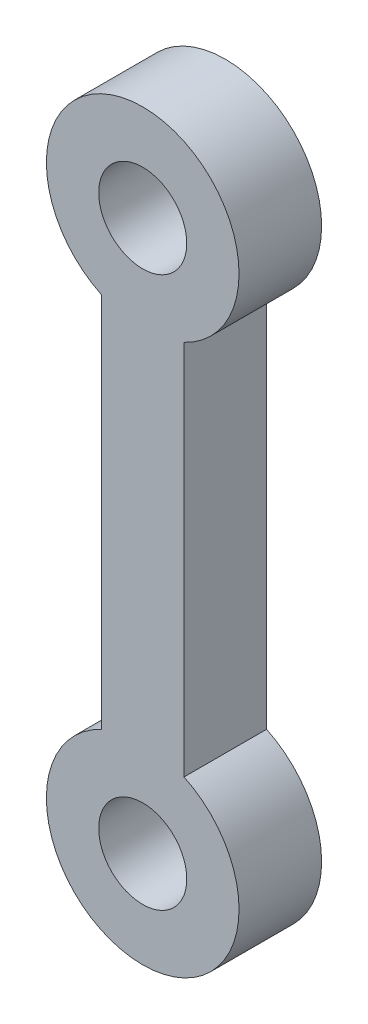
ISO-10303-21;
HEADER;
FILE_DESCRIPTION(('STEP AP214'),'2;1');
FILE_NAME('part.step','',(''),(''),'','','');
FILE_SCHEMA(('AUTOMOTIVE_DESIGN { 1 0 10303 214 1 1 1 1 }'));
ENDSEC;
DATA;
#1=APPLICATION_CONTEXT('core data for automotive mechanical design processes');
#2=APPLICATION_PROTOCOL_DEFINITION('international standard','automotive_design',2000,#1);
#3=PRODUCT_CONTEXT('',#1,'mechanical');
#4=PRODUCT('Part','Part','',(#3));
#5=PRODUCT_RELATED_PRODUCT_CATEGORY('part','',(#4));
#6=PRODUCT_DEFINITION_FORMATION('','',#4);
#7=PRODUCT_DEFINITION_CONTEXT('part definition',#1,'design');
#8=PRODUCT_DEFINITION('design','',#6,#7);
#9=PRODUCT_DEFINITION_SHAPE('','',#8);
#10=(LENGTH_UNIT() NAMED_UNIT(*) SI_UNIT(.MILLI.,.METRE.));
#11=(NAMED_UNIT(*) PLANE_ANGLE_UNIT() SI_UNIT($,.RADIAN.));
#12=(NAMED_UNIT(*) SI_UNIT($,.STERADIAN.) SOLID_ANGLE_UNIT());
#13=UNCERTAINTY_MEASURE_WITH_UNIT(LENGTH_MEASURE(1.E-05),#10,'distance_accuracy_value','');
#14=(GEOMETRIC_REPRESENTATION_CONTEXT(3) GLOBAL_UNCERTAINTY_ASSIGNED_CONTEXT((#13)) GLOBAL_UNIT_ASSIGNED_CONTEXT((#10,
#11,#12)) REPRESENTATION_CONTEXT('',''));
#15=CARTESIAN_POINT('',(0.,0.,0.));
#16=DIRECTION('',(0.,0.,1.));
#17=DIRECTION('',(1.,0.,0.));
#18=AXIS2_PLACEMENT_3D('',#15,#16,#17);
#19=CARTESIAN_POINT('',(0.,0.,3.));
#20=DIRECTION('',(0.,0.,-1.));
#21=DIRECTION('',(-1.,0.,0.));
#22=AXIS2_PLACEMENT_3D('',#19,#20,#21);
#23=CYLINDRICAL_SURFACE('',#22,3.5);
#24=CARTESIAN_POINT('',(0.,0.,0.));
#25=DIRECTION('',(0.,0.,1.));
#26=DIRECTION('',(1.,0.,0.));
#27=AXIS2_PLACEMENT_3D('',#24,#25,#26);
#28=CIRCLE('',#27,3.5);
#29=CARTESIAN_POINT('',(1.5,-3.16227766016838,0.));
#30=VERTEX_POINT('',#29);
#31=CARTESIAN_POINT('',(-1.5,-3.16227766016838,0.));
#32=VERTEX_POINT('',#31);
#33=EDGE_CURVE('E121',#30,#32,#28,.T.);
#34=ORIENTED_EDGE('',*,*,#33,.T.);
#35=DIRECTION('',(0.,0.,-1.));
#36=VECTOR('',#35,1.);
#37=CARTESIAN_POINT('',(-1.5,-3.16227766016838,3.));
#38=LINE('',#37,#36);
#39=CARTESIAN_POINT('',(-1.5,-3.16227766016838,3.));
#40=VERTEX_POINT('',#39);
#41=EDGE_CURVE('E12',#40,#32,#38,.T.);
#42=ORIENTED_EDGE('',*,*,#41,.F.);
#43=CARTESIAN_POINT('',(0.,0.,3.));
#44=DIRECTION('',(0.,0.,1.));
#45=DIRECTION('',(1.,0.,0.));
#46=AXIS2_PLACEMENT_3D('',#43,#44,#45);
#47=CIRCLE('',#46,3.5);
#48=CARTESIAN_POINT('',(1.5,-3.16227766016838,3.));
#49=VERTEX_POINT('',#48);
#50=EDGE_CURVE('E103',#49,#40,#47,.T.);
#51=ORIENTED_EDGE('',*,*,#50,.F.);
#52=DIRECTION('',(0.,0.,-1.));
#53=VECTOR('',#52,1.);
#54=CARTESIAN_POINT('',(1.5,-3.16227766016838,3.));
#55=LINE('',#54,#53);
#56=EDGE_CURVE('E70',#49,#30,#55,.T.);
#57=ORIENTED_EDGE('',*,*,#56,.T.);
#58=EDGE_LOOP('',(#34,#42,#51,#57));
#59=FACE_BOUND('',#58,.T.);
#60=ADVANCED_FACE('F53',(#59),#23,.T.);
#61=CARTESIAN_POINT('',(-1.5,0.,3.));
#62=DIRECTION('',(1.,0.,0.));
#63=DIRECTION('',(0.,1.,0.));
#64=AXIS2_PLACEMENT_3D('',#61,#62,#63);
#65=PLANE('',#64);
#66=DIRECTION('',(0.,-1.,0.));
#67=VECTOR('',#66,1.);
#68=CARTESIAN_POINT('',(-1.5,0.,0.));
#69=LINE('',#68,#67);
#70=CARTESIAN_POINT('',(-1.5,-16.8377223398316,0.));
#71=VERTEX_POINT('',#70);
#72=EDGE_CURVE('E109',#32,#71,#69,.T.);
#73=ORIENTED_EDGE('',*,*,#72,.T.);
#74=DIRECTION('',(0.,0.,-1.));
#75=VECTOR('',#74,1.);
#76=CARTESIAN_POINT('',(-1.5,-16.8377223398316,3.));
#77=LINE('',#76,#75);
#78=CARTESIAN_POINT('',(-1.5,-16.8377223398316,3.));
#79=VERTEX_POINT('',#78);
#80=EDGE_CURVE('E62',#79,#71,#77,.T.);
#81=ORIENTED_EDGE('',*,*,#80,.F.);
#82=DIRECTION('',(0.,-1.,0.));
#83=VECTOR('',#82,1.);
#84=CARTESIAN_POINT('',(-1.5,0.,3.));
#85=LINE('',#84,#83);
#86=EDGE_CURVE('E96',#40,#79,#85,.T.);
#87=ORIENTED_EDGE('',*,*,#86,.F.);
#88=ORIENTED_EDGE('',*,*,#41,.T.);
#89=EDGE_LOOP('',(#73,#81,#87,#88));
#90=FACE_BOUND('',#89,.T.);
#91=ADVANCED_FACE('F108',(#90),#65,.F.);
#92=CARTESIAN_POINT('',(0.,-20.,3.));
#93=DIRECTION('',(0.,0.,-1.));
#94=DIRECTION('',(-1.,0.,0.));
#95=AXIS2_PLACEMENT_3D('',#92,#93,#94);
#96=CYLINDRICAL_SURFACE('',#95,3.5);
#97=CARTESIAN_POINT('',(0.,-20.,0.));
#98=DIRECTION('',(0.,0.,1.));
#99=DIRECTION('',(1.,0.,0.));
#100=AXIS2_PLACEMENT_3D('',#97,#98,#99);
#101=CIRCLE('',#100,3.5);
#102=CARTESIAN_POINT('',(1.5,-16.8377223398316,0.));
#103=VERTEX_POINT('',#102);
#104=EDGE_CURVE('E127',#71,#103,#101,.T.);
#105=ORIENTED_EDGE('',*,*,#104,.T.);
#106=DIRECTION('',(0.,0.,-1.));
#107=VECTOR('',#106,1.);
#108=CARTESIAN_POINT('',(1.5,-16.8377223398316,3.));
#109=LINE('',#108,#107);
#110=CARTESIAN_POINT('',(1.5,-16.8377223398316,3.));
#111=VERTEX_POINT('',#110);
#112=EDGE_CURVE('E85',#111,#103,#109,.T.);
#113=ORIENTED_EDGE('',*,*,#112,.F.);
#114=CARTESIAN_POINT('',(0.,-20.,3.));
#115=DIRECTION('',(0.,0.,1.));
#116=DIRECTION('',(1.,0.,0.));
#117=AXIS2_PLACEMENT_3D('',#114,#115,#116);
#118=CIRCLE('',#117,3.5);
#119=EDGE_CURVE('E102',#79,#111,#118,.T.);
#120=ORIENTED_EDGE('',*,*,#119,.F.);
#121=ORIENTED_EDGE('',*,*,#80,.T.);
#122=EDGE_LOOP('',(#105,#113,#120,#121));
#123=FACE_BOUND('',#122,.T.);
#124=ADVANCED_FACE('F113',(#123),#96,.T.);
#125=CARTESIAN_POINT('',(1.5,0.,3.));
#126=DIRECTION('',(1.,0.,0.));
#127=DIRECTION('',(0.,1.,0.));
#128=AXIS2_PLACEMENT_3D('',#125,#126,#127);
#129=PLANE('',#128);
#130=DIRECTION('',(0.,-1.,0.));
#131=VECTOR('',#130,1.);
#132=CARTESIAN_POINT('',(1.5,0.,0.));
#133=LINE('',#132,#131);
#134=EDGE_CURVE('E130',#30,#103,#133,.T.);
#135=ORIENTED_EDGE('',*,*,#134,.F.);
#136=ORIENTED_EDGE('',*,*,#56,.F.);
#137=DIRECTION('',(0.,-1.,0.));
#138=VECTOR('',#137,1.);
#139=CARTESIAN_POINT('',(1.5,0.,3.));
#140=LINE('',#139,#138);
#141=EDGE_CURVE('E115',#49,#111,#140,.T.);
#142=ORIENTED_EDGE('',*,*,#141,.T.);
#143=ORIENTED_EDGE('',*,*,#112,.T.);
#144=EDGE_LOOP('',(#135,#136,#142,#143));
#145=FACE_BOUND('',#144,.T.);
#146=ADVANCED_FACE('F168',(#145),#129,.T.);
#147=CARTESIAN_POINT('',(0.,0.,3.));
#148=DIRECTION('',(0.,0.,1.));
#149=DIRECTION('',(1.,0.,0.));
#150=AXIS2_PLACEMENT_3D('',#147,#148,#149);
#151=PLANE('',#150);
#152=CARTESIAN_POINT('',(0.,-20.,3.));
#153=DIRECTION('',(0.,0.,1.));
#154=DIRECTION('',(1.,0.,0.));
#155=AXIS2_PLACEMENT_3D('',#152,#153,#154);
#156=CIRCLE('',#155,1.6);
#157=CARTESIAN_POINT('',(1.6,-20.,3.));
#158=VERTEX_POINT('',#157);
#159=EDGE_CURVE('E148',#158,#158,#156,.T.);
#160=ORIENTED_EDGE('',*,*,#159,.F.);
#161=EDGE_LOOP('',(#160));
#162=FACE_BOUND('',#161,.T.);
#163=CARTESIAN_POINT('',(0.,0.,3.));
#164=DIRECTION('',(0.,0.,1.));
#165=DIRECTION('',(1.,0.,0.));
#166=AXIS2_PLACEMENT_3D('',#163,#164,#165);
#167=CIRCLE('',#166,1.6);
#168=CARTESIAN_POINT('',(1.6,0.,3.));
#169=VERTEX_POINT('',#168);
#170=EDGE_CURVE('E144',#169,#169,#167,.T.);
#171=ORIENTED_EDGE('',*,*,#170,.F.);
#172=EDGE_LOOP('',(#171));
#173=FACE_BOUND('',#172,.T.);
#174=ORIENTED_EDGE('',*,*,#50,.T.);
#175=ORIENTED_EDGE('',*,*,#86,.T.);
#176=ORIENTED_EDGE('',*,*,#119,.T.);
#177=ORIENTED_EDGE('',*,*,#141,.F.);
#178=EDGE_LOOP('',(#174,#175,#176,#177));
#179=FACE_BOUND('',#178,.T.);
#180=ADVANCED_FACE('F99',(#162,#173,#179),#151,.T.);
#181=CARTESIAN_POINT('',(0.,0.,0.));
#182=DIRECTION('',(0.,0.,1.));
#183=DIRECTION('',(1.,0.,0.));
#184=AXIS2_PLACEMENT_3D('',#181,#182,#183);
#185=PLANE('',#184);
#186=CARTESIAN_POINT('',(0.,-20.,0.));
#187=DIRECTION('',(0.,0.,1.));
#188=DIRECTION('',(1.,0.,0.));
#189=AXIS2_PLACEMENT_3D('',#186,#187,#188);
#190=CIRCLE('',#189,1.6);
#191=CARTESIAN_POINT('',(1.6,-20.,0.));
#192=VERTEX_POINT('',#191);
#193=EDGE_CURVE('E124',#192,#192,#190,.T.);
#194=ORIENTED_EDGE('',*,*,#193,.T.);
#195=EDGE_LOOP('',(#194));
#196=FACE_BOUND('',#195,.T.);
#197=CARTESIAN_POINT('',(0.,0.,0.));
#198=DIRECTION('',(0.,0.,1.));
#199=DIRECTION('',(1.,0.,0.));
#200=AXIS2_PLACEMENT_3D('',#197,#198,#199);
#201=CIRCLE('',#200,1.6);
#202=CARTESIAN_POINT('',(1.6,0.,0.));
#203=VERTEX_POINT('',#202);
#204=EDGE_CURVE('E140',#203,#203,#201,.T.);
#205=ORIENTED_EDGE('',*,*,#204,.T.);
#206=EDGE_LOOP('',(#205));
#207=FACE_BOUND('',#206,.T.);
#208=ORIENTED_EDGE('',*,*,#33,.F.);
#209=ORIENTED_EDGE('',*,*,#134,.T.);
#210=ORIENTED_EDGE('',*,*,#104,.F.);
#211=ORIENTED_EDGE('',*,*,#72,.F.);
#212=EDGE_LOOP('',(#208,#209,#210,#211));
#213=FACE_BOUND('',#212,.T.);
#214=ADVANCED_FACE('F156',(#196,#207,#213),#185,.F.);
#215=CARTESIAN_POINT('',(0.,0.,0.));
#216=DIRECTION('',(0.,0.,1.));
#217=DIRECTION('',(1.,0.,0.));
#218=AXIS2_PLACEMENT_3D('',#215,#216,#217);
#219=CYLINDRICAL_SURFACE('',#218,1.6);
#220=ORIENTED_EDGE('',*,*,#204,.F.);
#221=EDGE_LOOP('',(#220));
#222=FACE_BOUND('',#221,.T.);
#223=ORIENTED_EDGE('',*,*,#170,.T.);
#224=EDGE_LOOP('',(#223));
#225=FACE_BOUND('',#224,.T.);
#226=ADVANCED_FACE('F162',(#222,#225),#219,.F.);
#227=CARTESIAN_POINT('',(0.,-20.,0.));
#228=DIRECTION('',(0.,0.,1.));
#229=DIRECTION('',(1.,0.,0.));
#230=AXIS2_PLACEMENT_3D('',#227,#228,#229);
#231=CYLINDRICAL_SURFACE('',#230,1.6);
#232=ORIENTED_EDGE('',*,*,#193,.F.);
#233=EDGE_LOOP('',(#232));
#234=FACE_BOUND('',#233,.T.);
#235=ORIENTED_EDGE('',*,*,#159,.T.);
#236=EDGE_LOOP('',(#235));
#237=FACE_BOUND('',#236,.T.);
#238=ADVANCED_FACE('F159',(#234,#237),#231,.F.);
#239=CLOSED_SHELL('',(#60,#91,#124,#146,#180,#214,#226,#238));
#240=MANIFOLD_SOLID_BREP('B2',#239);
#241=ADVANCED_BREP_SHAPE_REPRESENTATION('',(#18,#240),#14);
#242=SHAPE_DEFINITION_REPRESENTATION(#9,#241);
ENDSEC;
END-ISO-10303-21;
